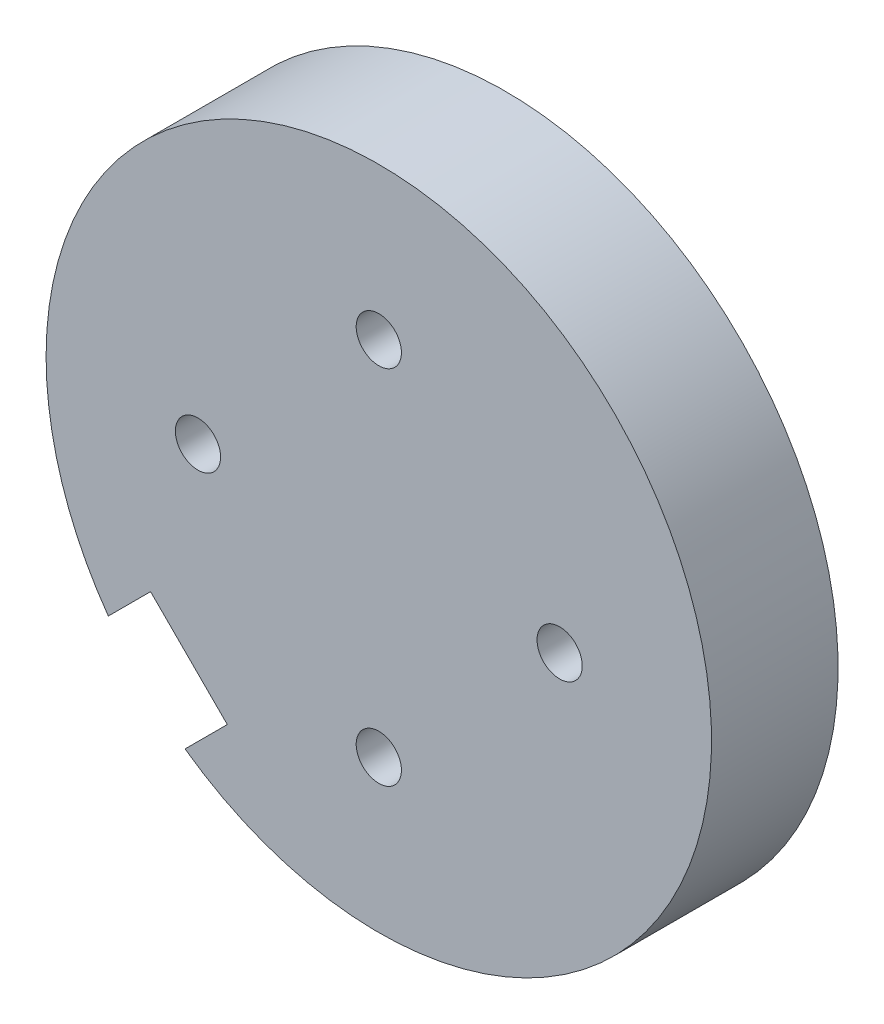
ISO-10303-21;
HEADER;
FILE_DESCRIPTION(('STEP AP214'),'2;1');
FILE_NAME('part.step','',(''),(''),'','','');
FILE_SCHEMA(('AUTOMOTIVE_DESIGN { 1 0 10303 214 1 1 1 1 }'));
ENDSEC;
DATA;
#1=APPLICATION_CONTEXT('core data for automotive mechanical design processes');
#2=APPLICATION_PROTOCOL_DEFINITION('international standard','automotive_design',2000,#1);
#3=PRODUCT_CONTEXT('',#1,'mechanical');
#4=PRODUCT('Part','Part','',(#3));
#5=PRODUCT_RELATED_PRODUCT_CATEGORY('part','',(#4));
#6=PRODUCT_DEFINITION_FORMATION('','',#4);
#7=PRODUCT_DEFINITION_CONTEXT('part definition',#1,'design');
#8=PRODUCT_DEFINITION('design','',#6,#7);
#9=PRODUCT_DEFINITION_SHAPE('','',#8);
#10=(LENGTH_UNIT() NAMED_UNIT(*) SI_UNIT(.MILLI.,.METRE.));
#11=(NAMED_UNIT(*) PLANE_ANGLE_UNIT() SI_UNIT($,.RADIAN.));
#12=(NAMED_UNIT(*) SI_UNIT($,.STERADIAN.) SOLID_ANGLE_UNIT());
#13=UNCERTAINTY_MEASURE_WITH_UNIT(LENGTH_MEASURE(1.E-05),#10,'distance_accuracy_value','');
#14=(GEOMETRIC_REPRESENTATION_CONTEXT(3) GLOBAL_UNCERTAINTY_ASSIGNED_CONTEXT((#13)) GLOBAL_UNIT_ASSIGNED_CONTEXT((#10,
#11,#12)) REPRESENTATION_CONTEXT('',''));
#15=CARTESIAN_POINT('',(0.,0.,0.));
#16=DIRECTION('',(0.,0.,1.));
#17=DIRECTION('',(1.,0.,0.));
#18=AXIS2_PLACEMENT_3D('',#15,#16,#17);
#19=CARTESIAN_POINT('',(0.,0.,26.3));
#20=DIRECTION('',(0.,0.,-1.));
#21=DIRECTION('',(-1.,0.,0.));
#22=AXIS2_PLACEMENT_3D('',#19,#20,#21);
#23=CYLINDRICAL_SURFACE('',#22,18.4);
#24=CARTESIAN_POINT('',(0.,0.,26.3));
#25=DIRECTION('',(0.,0.,1.));
#26=DIRECTION('',(1.,0.,0.));
#27=AXIS2_PLACEMENT_3D('',#24,#25,#26);
#28=CIRCLE('',#27,18.4);
#29=CARTESIAN_POINT('',(-10.7153458903186,-14.9579865774386,26.3));
#30=VERTEX_POINT('',#29);
#31=CARTESIAN_POINT('',(-14.957986577438,-10.7153458903194,26.3));
#32=VERTEX_POINT('',#31);
#33=EDGE_CURVE('E11',#30,#32,#28,.T.);
#34=ORIENTED_EDGE('',*,*,#33,.F.);
#35=DIRECTION('',(0.,0.,1.));
#36=VECTOR('',#35,1.);
#37=CARTESIAN_POINT('',(-10.7153458903186,-14.9579865774386,21.3));
#38=LINE('',#37,#36);
#39=CARTESIAN_POINT('',(-10.7153458903186,-14.9579865774386,21.3));
#40=VERTEX_POINT('',#39);
#41=EDGE_CURVE('E40',#40,#30,#38,.T.);
#42=ORIENTED_EDGE('',*,*,#41,.F.);
#43=CARTESIAN_POINT('',(2.73132211292541E-12,2.73132211292556E-12,21.3));
#44=DIRECTION('',(0.,0.,1.));
#45=DIRECTION('',(-1.,0.,0.));
#46=AXIS2_PLACEMENT_3D('',#43,#44,#45);
#47=CIRCLE('',#46,18.4000000000038);
#48=CARTESIAN_POINT('',(-14.957986577438,-10.7153458903194,21.3));
#49=VERTEX_POINT('',#48);
#50=EDGE_CURVE('E91',#49,#40,#47,.T.);
#51=ORIENTED_EDGE('',*,*,#50,.F.);
#52=DIRECTION('',(0.,0.,1.));
#53=VECTOR('',#52,1.);
#54=CARTESIAN_POINT('',(-14.957986577438,-10.7153458903194,21.3));
#55=LINE('',#54,#53);
#56=EDGE_CURVE('E83',#49,#32,#55,.T.);
#57=ORIENTED_EDGE('',*,*,#56,.T.);
#58=EDGE_LOOP('',(#34,#42,#51,#57));
#59=FACE_BOUND('',#58,.T.);
#60=CARTESIAN_POINT('',(0.,0.,19.3));
#61=DIRECTION('',(0.,0.,-1.));
#62=DIRECTION('',(-1.,0.,0.));
#63=AXIS2_PLACEMENT_3D('',#60,#61,#62);
#64=CIRCLE('',#63,18.4);
#65=CARTESIAN_POINT('',(-18.4,0.,19.3));
#66=VERTEX_POINT('',#65);
#67=EDGE_CURVE('E113',#66,#66,#64,.T.);
#68=ORIENTED_EDGE('',*,*,#67,.F.);
#69=EDGE_LOOP('',(#68));
#70=FACE_BOUND('',#69,.T.);
#71=ADVANCED_FACE('F33',(#59,#70),#23,.T.);
#72=CARTESIAN_POINT('',(0.,0.,26.3));
#73=DIRECTION('',(0.,0.,1.));
#74=DIRECTION('',(1.,0.,0.));
#75=AXIS2_PLACEMENT_3D('',#72,#73,#74);
#76=PLANE('',#75);
#77=CARTESIAN_POINT('',(0.,10.,26.3));
#78=DIRECTION('',(0.,0.,1.));
#79=DIRECTION('',(1.,0.,0.));
#80=AXIS2_PLACEMENT_3D('',#77,#78,#79);
#81=CIRCLE('',#80,1.25);
#82=CARTESIAN_POINT('',(1.25,10.,26.3));
#83=VERTEX_POINT('',#82);
#84=EDGE_CURVE('E137',#83,#83,#81,.T.);
#85=ORIENTED_EDGE('',*,*,#84,.F.);
#86=EDGE_LOOP('',(#85));
#87=FACE_BOUND('',#86,.T.);
#88=CARTESIAN_POINT('',(10.0000000000003,2.68873441299627E-13,26.3));
#89=DIRECTION('',(0.,0.,1.));
#90=DIRECTION('',(1.,0.,0.));
#91=AXIS2_PLACEMENT_3D('',#88,#89,#90);
#92=CIRCLE('',#91,1.25);
#93=CARTESIAN_POINT('',(11.2500000000003,2.68873441299627E-13,26.3));
#94=VERTEX_POINT('',#93);
#95=EDGE_CURVE('E129',#94,#94,#92,.T.);
#96=ORIENTED_EDGE('',*,*,#95,.F.);
#97=EDGE_LOOP('',(#96));
#98=FACE_BOUND('',#97,.T.);
#99=CARTESIAN_POINT('',(5.37746882599254E-13,-10.,26.3));
#100=DIRECTION('',(0.,0.,1.));
#101=DIRECTION('',(1.,0.,0.));
#102=AXIS2_PLACEMENT_3D('',#99,#100,#101);
#103=CIRCLE('',#102,1.25);
#104=CARTESIAN_POINT('',(1.25000000000054,-10.,26.3));
#105=VERTEX_POINT('',#104);
#106=EDGE_CURVE('E130',#105,#105,#103,.T.);
#107=ORIENTED_EDGE('',*,*,#106,.F.);
#108=EDGE_LOOP('',(#107));
#109=FACE_BOUND('',#108,.T.);
#110=CARTESIAN_POINT('',(-9.99999999999973,-2.70098088098774E-13,26.3));
#111=DIRECTION('',(0.,0.,1.));
#112=DIRECTION('',(1.,0.,0.));
#113=AXIS2_PLACEMENT_3D('',#110,#111,#112);
#114=CIRCLE('',#113,1.25);
#115=CARTESIAN_POINT('',(-8.74999999999973,-2.70098088098774E-13,26.3));
#116=VERTEX_POINT('',#115);
#117=EDGE_CURVE('E115',#116,#116,#114,.T.);
#118=ORIENTED_EDGE('',*,*,#117,.F.);
#119=EDGE_LOOP('',(#118));
#120=FACE_BOUND('',#119,.T.);
#121=DIRECTION('',(0.707106781186528,0.707106781186567,0.));
#122=VECTOR('',#121,1.);
#123=CARTESIAN_POINT('',(-8.37918572298999,-12.6218264101098,26.3));
#124=LINE('',#123,#122);
#125=CARTESIAN_POINT('',(-8.37918572298999,-12.6218264101098,26.3));
#126=VERTEX_POINT('',#125);
#127=EDGE_CURVE('E47',#30,#126,#124,.T.);
#128=ORIENTED_EDGE('',*,*,#127,.F.);
#129=ORIENTED_EDGE('',*,*,#33,.T.);
#130=DIRECTION('',(-0.707106781186528,-0.707106781186567,0.));
#131=VECTOR('',#130,1.);
#132=CARTESIAN_POINT('',(-12.6218264101094,-8.37918572299067,26.3));
#133=LINE('',#132,#131);
#134=CARTESIAN_POINT('',(-12.6218264101094,-8.37918572299067,26.3));
#135=VERTEX_POINT('',#134);
#136=EDGE_CURVE('E95',#135,#32,#133,.T.);
#137=ORIENTED_EDGE('',*,*,#136,.F.);
#138=DIRECTION('',(-0.707106781186567,0.707106781186528,0.));
#139=VECTOR('',#138,1.);
#140=CARTESIAN_POINT('',(-8.37918572298999,-12.6218264101098,26.3));
#141=LINE('',#140,#139);
#142=EDGE_CURVE('E80',#126,#135,#141,.T.);
#143=ORIENTED_EDGE('',*,*,#142,.F.);
#144=EDGE_LOOP('',(#128,#129,#137,#143));
#145=FACE_BOUND('',#144,.T.);
#146=ADVANCED_FACE('F106',(#87,#98,#109,#120,#145),#76,.T.);
#147=CARTESIAN_POINT('',(-8.37918572298999,-12.6218264101098,21.3));
#148=DIRECTION('',(0.707106781186567,-0.707106781186528,0.));
#149=DIRECTION('',(0.707106781186528,0.707106781186567,0.));
#150=AXIS2_PLACEMENT_3D('',#147,#148,#149);
#151=PLANE('',#150);
#152=ORIENTED_EDGE('',*,*,#127,.T.);
#153=DIRECTION('',(0.,0.,1.));
#154=VECTOR('',#153,1.);
#155=CARTESIAN_POINT('',(-8.37918572298999,-12.6218264101098,21.3));
#156=LINE('',#155,#154);
#157=CARTESIAN_POINT('',(-8.37918572298999,-12.6218264101098,21.3));
#158=VERTEX_POINT('',#157);
#159=EDGE_CURVE('E69',#158,#126,#156,.T.);
#160=ORIENTED_EDGE('',*,*,#159,.F.);
#161=DIRECTION('',(0.707106781186528,0.707106781186567,0.));
#162=VECTOR('',#161,1.);
#163=CARTESIAN_POINT('',(-8.37918572298999,-12.6218264101098,21.3));
#164=LINE('',#163,#162);
#165=EDGE_CURVE('E53',#40,#158,#164,.T.);
#166=ORIENTED_EDGE('',*,*,#165,.F.);
#167=ORIENTED_EDGE('',*,*,#41,.T.);
#168=EDGE_LOOP('',(#152,#160,#166,#167));
#169=FACE_BOUND('',#168,.T.);
#170=ADVANCED_FACE('F149',(#169),#151,.F.);
#171=CARTESIAN_POINT('',(-12.6218264101094,-8.37918572299067,21.3));
#172=DIRECTION('',(-0.707106781186567,0.707106781186528,0.));
#173=DIRECTION('',(-0.707106781186528,-0.707106781186567,0.));
#174=AXIS2_PLACEMENT_3D('',#171,#172,#173);
#175=PLANE('',#174);
#176=ORIENTED_EDGE('',*,*,#136,.T.);
#177=ORIENTED_EDGE('',*,*,#56,.F.);
#178=DIRECTION('',(-0.707106781186528,-0.707106781186567,0.));
#179=VECTOR('',#178,1.);
#180=CARTESIAN_POINT('',(-12.6218264101094,-8.37918572299067,21.3));
#181=LINE('',#180,#179);
#182=CARTESIAN_POINT('',(-12.6218264101094,-8.37918572299067,21.3));
#183=VERTEX_POINT('',#182);
#184=EDGE_CURVE('E86',#183,#49,#181,.T.);
#185=ORIENTED_EDGE('',*,*,#184,.F.);
#186=DIRECTION('',(0.,0.,1.));
#187=VECTOR('',#186,1.);
#188=CARTESIAN_POINT('',(-12.6218264101094,-8.37918572299067,21.3));
#189=LINE('',#188,#187);
#190=EDGE_CURVE('E74',#183,#135,#189,.T.);
#191=ORIENTED_EDGE('',*,*,#190,.T.);
#192=EDGE_LOOP('',(#176,#177,#185,#191));
#193=FACE_BOUND('',#192,.T.);
#194=ADVANCED_FACE('F87',(#193),#175,.F.);
#195=CARTESIAN_POINT('',(-8.37918572298999,-12.6218264101098,21.3));
#196=DIRECTION('',(0.707106781186528,0.707106781186567,0.));
#197=DIRECTION('',(-0.707106781186567,0.707106781186528,0.));
#198=AXIS2_PLACEMENT_3D('',#195,#196,#197);
#199=PLANE('',#198);
#200=ORIENTED_EDGE('',*,*,#142,.T.);
#201=ORIENTED_EDGE('',*,*,#190,.F.);
#202=DIRECTION('',(-0.707106781186567,0.707106781186528,0.));
#203=VECTOR('',#202,1.);
#204=CARTESIAN_POINT('',(-8.37918572298999,-12.6218264101098,21.3));
#205=LINE('',#204,#203);
#206=EDGE_CURVE('E78',#158,#183,#205,.T.);
#207=ORIENTED_EDGE('',*,*,#206,.F.);
#208=ORIENTED_EDGE('',*,*,#159,.T.);
#209=EDGE_LOOP('',(#200,#201,#207,#208));
#210=FACE_BOUND('',#209,.T.);
#211=ADVANCED_FACE('F76',(#210),#199,.F.);
#212=CARTESIAN_POINT('',(2.73132211292541E-12,2.73132211292556E-12,21.3));
#213=DIRECTION('',(0.,0.,-1.));
#214=DIRECTION('',(-1.,0.,0.));
#215=AXIS2_PLACEMENT_3D('',#212,#213,#214);
#216=PLANE('',#215);
#217=ORIENTED_EDGE('',*,*,#165,.T.);
#218=ORIENTED_EDGE('',*,*,#206,.T.);
#219=ORIENTED_EDGE('',*,*,#184,.T.);
#220=ORIENTED_EDGE('',*,*,#50,.T.);
#221=EDGE_LOOP('',(#217,#218,#219,#220));
#222=FACE_BOUND('',#221,.T.);
#223=ADVANCED_FACE('F93',(#222),#216,.F.);
#224=CARTESIAN_POINT('',(-9.99999999999973,-2.70098088098774E-13,21.3));
#225=DIRECTION('',(0.,0.,1.));
#226=DIRECTION('',(1.,0.,0.));
#227=AXIS2_PLACEMENT_3D('',#224,#225,#226);
#228=CYLINDRICAL_SURFACE('',#227,1.25);
#229=CARTESIAN_POINT('',(-9.99999999999973,-2.70098088098774E-13,21.3));
#230=DIRECTION('',(0.,0.,1.));
#231=DIRECTION('',(1.,0.,0.));
#232=AXIS2_PLACEMENT_3D('',#229,#230,#231);
#233=CIRCLE('',#232,1.25);
#234=CARTESIAN_POINT('',(-8.74999999999973,-2.70098088098774E-13,21.3));
#235=VERTEX_POINT('',#234);
#236=EDGE_CURVE('E119',#235,#235,#233,.T.);
#237=ORIENTED_EDGE('',*,*,#236,.F.);
#238=EDGE_LOOP('',(#237));
#239=FACE_BOUND('',#238,.T.);
#240=ORIENTED_EDGE('',*,*,#117,.T.);
#241=EDGE_LOOP('',(#240));
#242=FACE_BOUND('',#241,.T.);
#243=ADVANCED_FACE('F155',(#239,#242),#228,.F.);
#244=CARTESIAN_POINT('',(-9.99999999999973,-2.70098088098774E-13,21.3));
#245=DIRECTION('',(0.,0.,1.));
#246=DIRECTION('',(1.,0.,0.));
#247=AXIS2_PLACEMENT_3D('',#244,#245,#246);
#248=PLANE('',#247);
#249=ORIENTED_EDGE('',*,*,#236,.T.);
#250=EDGE_LOOP('',(#249));
#251=FACE_BOUND('',#250,.T.);
#252=ADVANCED_FACE('F157',(#251),#248,.T.);
#253=CARTESIAN_POINT('',(5.37746882599254E-13,-10.,21.3));
#254=DIRECTION('',(0.,0.,1.));
#255=DIRECTION('',(1.,0.,0.));
#256=AXIS2_PLACEMENT_3D('',#253,#254,#255);
#257=CYLINDRICAL_SURFACE('',#256,1.25);
#258=CARTESIAN_POINT('',(5.37746882599254E-13,-10.,21.3));
#259=DIRECTION('',(0.,0.,1.));
#260=DIRECTION('',(1.,0.,0.));
#261=AXIS2_PLACEMENT_3D('',#258,#259,#260);
#262=CIRCLE('',#261,1.25);
#263=CARTESIAN_POINT('',(1.25000000000054,-10.,21.3));
#264=VERTEX_POINT('',#263);
#265=EDGE_CURVE('E126',#264,#264,#262,.T.);
#266=ORIENTED_EDGE('',*,*,#265,.F.);
#267=EDGE_LOOP('',(#266));
#268=FACE_BOUND('',#267,.T.);
#269=ORIENTED_EDGE('',*,*,#106,.T.);
#270=EDGE_LOOP('',(#269));
#271=FACE_BOUND('',#270,.T.);
#272=ADVANCED_FACE('F164',(#268,#271),#257,.F.);
#273=CARTESIAN_POINT('',(5.37746882599254E-13,-10.,21.3));
#274=DIRECTION('',(0.,0.,1.));
#275=DIRECTION('',(1.,0.,0.));
#276=AXIS2_PLACEMENT_3D('',#273,#274,#275);
#277=PLANE('',#276);
#278=ORIENTED_EDGE('',*,*,#265,.T.);
#279=EDGE_LOOP('',(#278));
#280=FACE_BOUND('',#279,.T.);
#281=ADVANCED_FACE('F185',(#280),#277,.T.);
#282=CARTESIAN_POINT('',(10.0000000000003,2.68873441299627E-13,21.3));
#283=DIRECTION('',(0.,0.,1.));
#284=DIRECTION('',(1.,0.,0.));
#285=AXIS2_PLACEMENT_3D('',#282,#283,#284);
#286=CYLINDRICAL_SURFACE('',#285,1.25);
#287=CARTESIAN_POINT('',(10.0000000000003,2.68873441299627E-13,21.3));
#288=DIRECTION('',(0.,0.,1.));
#289=DIRECTION('',(1.,0.,0.));
#290=AXIS2_PLACEMENT_3D('',#287,#288,#289);
#291=CIRCLE('',#290,1.25);
#292=CARTESIAN_POINT('',(11.2500000000003,2.68873441299627E-13,21.3));
#293=VERTEX_POINT('',#292);
#294=EDGE_CURVE('E140',#293,#293,#291,.T.);
#295=ORIENTED_EDGE('',*,*,#294,.F.);
#296=EDGE_LOOP('',(#295));
#297=FACE_BOUND('',#296,.T.);
#298=ORIENTED_EDGE('',*,*,#95,.T.);
#299=EDGE_LOOP('',(#298));
#300=FACE_BOUND('',#299,.T.);
#301=ADVANCED_FACE('F145',(#297,#300),#286,.F.);
#302=CARTESIAN_POINT('',(10.0000000000003,2.68873441299627E-13,21.3));
#303=DIRECTION('',(0.,0.,1.));
#304=DIRECTION('',(1.,0.,0.));
#305=AXIS2_PLACEMENT_3D('',#302,#303,#304);
#306=PLANE('',#305);
#307=ORIENTED_EDGE('',*,*,#294,.T.);
#308=EDGE_LOOP('',(#307));
#309=FACE_BOUND('',#308,.T.);
#310=ADVANCED_FACE('F179',(#309),#306,.T.);
#311=CARTESIAN_POINT('',(0.,10.,21.3));
#312=DIRECTION('',(0.,0.,1.));
#313=DIRECTION('',(1.,0.,0.));
#314=AXIS2_PLACEMENT_3D('',#311,#312,#313);
#315=CYLINDRICAL_SURFACE('',#314,1.25);
#316=CARTESIAN_POINT('',(0.,10.,21.3));
#317=DIRECTION('',(0.,0.,1.));
#318=DIRECTION('',(1.,0.,0.));
#319=AXIS2_PLACEMENT_3D('',#316,#317,#318);
#320=CIRCLE('',#319,1.25);
#321=CARTESIAN_POINT('',(1.25,10.,21.3));
#322=VERTEX_POINT('',#321);
#323=EDGE_CURVE('E101',#322,#322,#320,.T.);
#324=ORIENTED_EDGE('',*,*,#323,.F.);
#325=EDGE_LOOP('',(#324));
#326=FACE_BOUND('',#325,.T.);
#327=ORIENTED_EDGE('',*,*,#84,.T.);
#328=EDGE_LOOP('',(#327));
#329=FACE_BOUND('',#328,.T.);
#330=ADVANCED_FACE('F175',(#326,#329),#315,.F.);
#331=CARTESIAN_POINT('',(0.,10.,21.3));
#332=DIRECTION('',(0.,0.,1.));
#333=DIRECTION('',(1.,0.,0.));
#334=AXIS2_PLACEMENT_3D('',#331,#332,#333);
#335=PLANE('',#334);
#336=ORIENTED_EDGE('',*,*,#323,.T.);
#337=EDGE_LOOP('',(#336));
#338=FACE_BOUND('',#337,.T.);
#339=ADVANCED_FACE('F171',(#338),#335,.T.);
#340=CARTESIAN_POINT('',(0.,0.,19.3));
#341=DIRECTION('',(0.,0.,-1.));
#342=DIRECTION('',(-1.,0.,0.));
#343=AXIS2_PLACEMENT_3D('',#340,#341,#342);
#344=PLANE('',#343);
#345=CARTESIAN_POINT('',(0.,0.,19.3));
#346=DIRECTION('',(0.,0.,-1.));
#347=DIRECTION('',(-1.,0.,0.));
#348=AXIS2_PLACEMENT_3D('',#345,#346,#347);
#349=CIRCLE('',#348,6.);
#350=CARTESIAN_POINT('',(-6.,0.,19.3));
#351=VERTEX_POINT('',#350);
#352=EDGE_CURVE('E122',#351,#351,#349,.T.);
#353=ORIENTED_EDGE('',*,*,#352,.F.);
#354=EDGE_LOOP('',(#353));
#355=FACE_BOUND('',#354,.T.);
#356=ORIENTED_EDGE('',*,*,#67,.T.);
#357=EDGE_LOOP('',(#356));
#358=FACE_BOUND('',#357,.T.);
#359=ADVANCED_FACE('F174',(#355,#358),#344,.T.);
#360=CARTESIAN_POINT('',(0.,0.,20.3));
#361=DIRECTION('',(0.,0.,-1.));
#362=DIRECTION('',(-1.,0.,0.));
#363=AXIS2_PLACEMENT_3D('',#360,#361,#362);
#364=CYLINDRICAL_SURFACE('',#363,6.);
#365=CARTESIAN_POINT('',(0.,0.,20.3));
#366=DIRECTION('',(0.,0.,-1.));
#367=DIRECTION('',(-1.,0.,0.));
#368=AXIS2_PLACEMENT_3D('',#365,#366,#367);
#369=CIRCLE('',#368,6.);
#370=CARTESIAN_POINT('',(-6.,0.,20.3));
#371=VERTEX_POINT('',#370);
#372=EDGE_CURVE('E116',#371,#371,#369,.T.);
#373=ORIENTED_EDGE('',*,*,#372,.F.);
#374=EDGE_LOOP('',(#373));
#375=FACE_BOUND('',#374,.T.);
#376=ORIENTED_EDGE('',*,*,#352,.T.);
#377=EDGE_LOOP('',(#376));
#378=FACE_BOUND('',#377,.T.);
#379=ADVANCED_FACE('F275',(#375,#378),#364,.F.);
#380=CARTESIAN_POINT('',(0.,0.,20.3));
#381=DIRECTION('',(0.,0.,-1.));
#382=DIRECTION('',(-1.,0.,0.));
#383=AXIS2_PLACEMENT_3D('',#380,#381,#382);
#384=PLANE('',#383);
#385=ORIENTED_EDGE('',*,*,#372,.T.);
#386=EDGE_LOOP('',(#385));
#387=FACE_BOUND('',#386,.T.);
#388=ADVANCED_FACE('F285',(#387),#384,.T.);
#389=CLOSED_SHELL('',(#71,#146,#170,#194,#211,#223,#243,#252,#272,#281,#301,#310,#330,#339,#359,
#379,#388));
#390=MANIFOLD_SOLID_BREP('B2',#389);
#391=ADVANCED_BREP_SHAPE_REPRESENTATION('',(#18,#390),#14);
#392=SHAPE_DEFINITION_REPRESENTATION(#9,#391);
ENDSEC;
END-ISO-10303-21;
